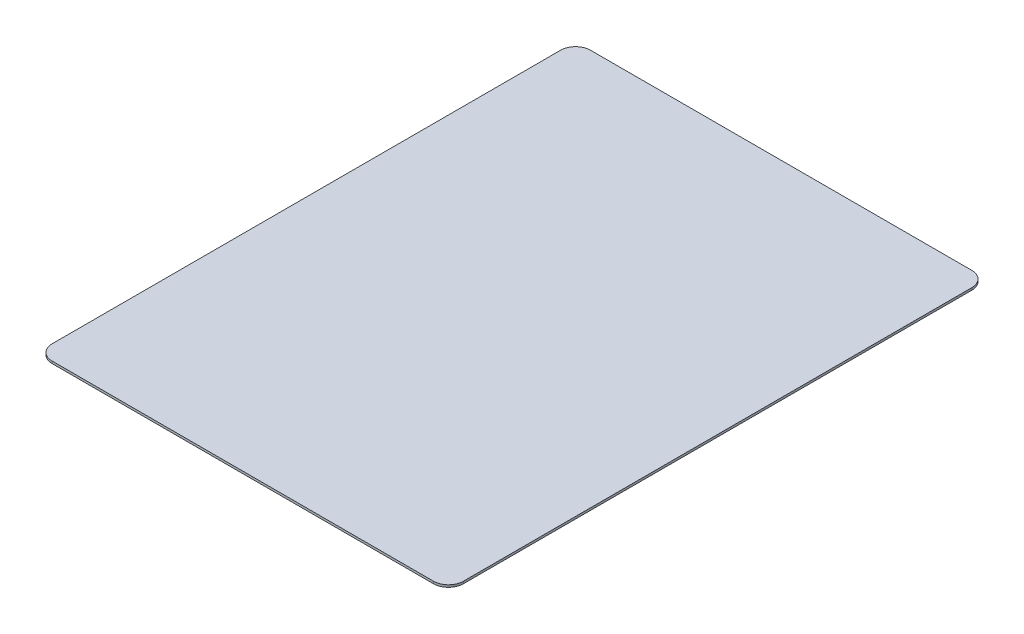
ISO-10303-21;
HEADER;
FILE_DESCRIPTION(('STEP AP214'),'2;1');
FILE_NAME('part.step','',(''),(''),'','','');
FILE_SCHEMA(('AUTOMOTIVE_DESIGN { 1 0 10303 214 1 1 1 1 }'));
ENDSEC;
DATA;
#1=APPLICATION_CONTEXT('core data for automotive mechanical design processes');
#2=APPLICATION_PROTOCOL_DEFINITION('international standard','automotive_design',2000,#1);
#3=PRODUCT_CONTEXT('',#1,'mechanical');
#4=PRODUCT('Part','Part','',(#3));
#5=PRODUCT_RELATED_PRODUCT_CATEGORY('part','',(#4));
#6=PRODUCT_DEFINITION_FORMATION('','',#4);
#7=PRODUCT_DEFINITION_CONTEXT('part definition',#1,'design');
#8=PRODUCT_DEFINITION('design','',#6,#7);
#9=PRODUCT_DEFINITION_SHAPE('','',#8);
#10=(LENGTH_UNIT() NAMED_UNIT(*) SI_UNIT(.MILLI.,.METRE.));
#11=(NAMED_UNIT(*) PLANE_ANGLE_UNIT() SI_UNIT($,.RADIAN.));
#12=(NAMED_UNIT(*) SI_UNIT($,.STERADIAN.) SOLID_ANGLE_UNIT());
#13=UNCERTAINTY_MEASURE_WITH_UNIT(LENGTH_MEASURE(1.E-05),#10,'distance_accuracy_value','');
#14=(GEOMETRIC_REPRESENTATION_CONTEXT(3) GLOBAL_UNCERTAINTY_ASSIGNED_CONTEXT((#13)) GLOBAL_UNIT_ASSIGNED_CONTEXT((#10,
#11,#12)) REPRESENTATION_CONTEXT('',''));
#15=CARTESIAN_POINT('',(0.,0.,0.));
#16=DIRECTION('',(0.,0.,1.));
#17=DIRECTION('',(1.,0.,0.));
#18=AXIS2_PLACEMENT_3D('',#15,#16,#17);
#19=CARTESIAN_POINT('',(-255.,3.,340.));
#20=DIRECTION('',(0.,-1.,0.));
#21=DIRECTION('',(0.,0.,-1.));
#22=AXIS2_PLACEMENT_3D('',#19,#20,#21);
#23=CYLINDRICAL_SURFACE('',#22,20.);
#24=CARTESIAN_POINT('',(-255.,0.,340.));
#25=DIRECTION('',(0.,1.,0.));
#26=DIRECTION('',(0.,0.,-1.));
#27=AXIS2_PLACEMENT_3D('',#24,#25,#26);
#28=CIRCLE('',#27,20.);
#29=CARTESIAN_POINT('',(-275.,0.,340.));
#30=VERTEX_POINT('',#29);
#31=CARTESIAN_POINT('',(-255.,0.,360.));
#32=VERTEX_POINT('',#31);
#33=EDGE_CURVE('E139',#30,#32,#28,.T.);
#34=ORIENTED_EDGE('',*,*,#33,.T.);
#35=DIRECTION('',(0.,-1.,0.));
#36=VECTOR('',#35,1.);
#37=CARTESIAN_POINT('',(-255.,3.,360.));
#38=LINE('',#37,#36);
#39=CARTESIAN_POINT('',(-255.,3.,360.));
#40=VERTEX_POINT('',#39);
#41=EDGE_CURVE('E11',#40,#32,#38,.T.);
#42=ORIENTED_EDGE('',*,*,#41,.F.);
#43=CARTESIAN_POINT('',(-255.,3.,340.));
#44=DIRECTION('',(0.,1.,0.));
#45=DIRECTION('',(0.,0.,-1.));
#46=AXIS2_PLACEMENT_3D('',#43,#44,#45);
#47=CIRCLE('',#46,20.);
#48=CARTESIAN_POINT('',(-275.,3.,340.));
#49=VERTEX_POINT('',#48);
#50=EDGE_CURVE('E153',#49,#40,#47,.T.);
#51=ORIENTED_EDGE('',*,*,#50,.F.);
#52=DIRECTION('',(0.,-1.,0.));
#53=VECTOR('',#52,1.);
#54=CARTESIAN_POINT('',(-275.,3.,340.));
#55=LINE('',#54,#53);
#56=EDGE_CURVE('E135',#49,#30,#55,.T.);
#57=ORIENTED_EDGE('',*,*,#56,.T.);
#58=EDGE_LOOP('',(#34,#42,#51,#57));
#59=FACE_BOUND('',#58,.T.);
#60=ADVANCED_FACE('F43',(#59),#23,.T.);
#61=CARTESIAN_POINT('',(-255.,3.,360.));
#62=DIRECTION('',(0.,0.,-1.));
#63=DIRECTION('',(-1.,0.,0.));
#64=AXIS2_PLACEMENT_3D('',#61,#62,#63);
#65=PLANE('',#64);
#66=DIRECTION('',(1.,0.,0.));
#67=VECTOR('',#66,1.);
#68=CARTESIAN_POINT('',(-255.,0.,360.));
#69=LINE('',#68,#67);
#70=CARTESIAN_POINT('',(255.,0.,360.));
#71=VERTEX_POINT('',#70);
#72=EDGE_CURVE('E142',#32,#71,#69,.T.);
#73=ORIENTED_EDGE('',*,*,#72,.T.);
#74=DIRECTION('',(0.,-1.,0.));
#75=VECTOR('',#74,1.);
#76=CARTESIAN_POINT('',(255.,3.,360.));
#77=LINE('',#76,#75);
#78=CARTESIAN_POINT('',(255.,3.,360.));
#79=VERTEX_POINT('',#78);
#80=EDGE_CURVE('E51',#79,#71,#77,.T.);
#81=ORIENTED_EDGE('',*,*,#80,.F.);
#82=DIRECTION('',(1.,0.,0.));
#83=VECTOR('',#82,1.);
#84=CARTESIAN_POINT('',(-255.,3.,360.));
#85=LINE('',#84,#83);
#86=EDGE_CURVE('E102',#40,#79,#85,.T.);
#87=ORIENTED_EDGE('',*,*,#86,.F.);
#88=ORIENTED_EDGE('',*,*,#41,.T.);
#89=EDGE_LOOP('',(#73,#81,#87,#88));
#90=FACE_BOUND('',#89,.T.);
#91=ADVANCED_FACE('F188',(#90),#65,.F.);
#92=CARTESIAN_POINT('',(255.,3.,340.));
#93=DIRECTION('',(0.,-1.,0.));
#94=DIRECTION('',(0.,0.,-1.));
#95=AXIS2_PLACEMENT_3D('',#92,#93,#94);
#96=CYLINDRICAL_SURFACE('',#95,20.);
#97=CARTESIAN_POINT('',(255.,0.,340.));
#98=DIRECTION('',(0.,1.,0.));
#99=DIRECTION('',(0.,0.,-1.));
#100=AXIS2_PLACEMENT_3D('',#97,#98,#99);
#101=CIRCLE('',#100,20.);
#102=CARTESIAN_POINT('',(275.,0.,340.));
#103=VERTEX_POINT('',#102);
#104=EDGE_CURVE('E144',#71,#103,#101,.T.);
#105=ORIENTED_EDGE('',*,*,#104,.T.);
#106=DIRECTION('',(0.,-1.,0.));
#107=VECTOR('',#106,1.);
#108=CARTESIAN_POINT('',(275.,3.,340.));
#109=LINE('',#108,#107);
#110=CARTESIAN_POINT('',(275.,3.,340.));
#111=VERTEX_POINT('',#110);
#112=EDGE_CURVE('E160',#111,#103,#109,.T.);
#113=ORIENTED_EDGE('',*,*,#112,.F.);
#114=CARTESIAN_POINT('',(255.,3.,340.));
#115=DIRECTION('',(0.,1.,0.));
#116=DIRECTION('',(0.,0.,-1.));
#117=AXIS2_PLACEMENT_3D('',#114,#115,#116);
#118=CIRCLE('',#117,20.);
#119=EDGE_CURVE('E168',#79,#111,#118,.T.);
#120=ORIENTED_EDGE('',*,*,#119,.F.);
#121=ORIENTED_EDGE('',*,*,#80,.T.);
#122=EDGE_LOOP('',(#105,#113,#120,#121));
#123=FACE_BOUND('',#122,.T.);
#124=ADVANCED_FACE('F166',(#123),#96,.T.);
#125=CARTESIAN_POINT('',(275.,3.,-340.));
#126=DIRECTION('',(-1.,0.,0.));
#127=DIRECTION('',(0.,0.,1.));
#128=AXIS2_PLACEMENT_3D('',#125,#126,#127);
#129=PLANE('',#128);
#130=DIRECTION('',(0.,0.,-1.));
#131=VECTOR('',#130,1.);
#132=CARTESIAN_POINT('',(275.,0.,-340.));
#133=LINE('',#132,#131);
#134=CARTESIAN_POINT('',(275.,0.,-340.));
#135=VERTEX_POINT('',#134);
#136=EDGE_CURVE('E146',#103,#135,#133,.T.);
#137=ORIENTED_EDGE('',*,*,#136,.T.);
#138=DIRECTION('',(0.,-1.,0.));
#139=VECTOR('',#138,1.);
#140=CARTESIAN_POINT('',(275.,3.,-340.));
#141=LINE('',#140,#139);
#142=CARTESIAN_POINT('',(275.,3.,-340.));
#143=VERTEX_POINT('',#142);
#144=EDGE_CURVE('E157',#143,#135,#141,.T.);
#145=ORIENTED_EDGE('',*,*,#144,.F.);
#146=DIRECTION('',(0.,0.,-1.));
#147=VECTOR('',#146,1.);
#148=CARTESIAN_POINT('',(275.,3.,-340.));
#149=LINE('',#148,#147);
#150=EDGE_CURVE('E180',#111,#143,#149,.T.);
#151=ORIENTED_EDGE('',*,*,#150,.F.);
#152=ORIENTED_EDGE('',*,*,#112,.T.);
#153=EDGE_LOOP('',(#137,#145,#151,#152));
#154=FACE_BOUND('',#153,.T.);
#155=ADVANCED_FACE('F176',(#154),#129,.F.);
#156=CARTESIAN_POINT('',(255.,3.,-340.));
#157=DIRECTION('',(0.,-1.,0.));
#158=DIRECTION('',(0.,0.,-1.));
#159=AXIS2_PLACEMENT_3D('',#156,#157,#158);
#160=CYLINDRICAL_SURFACE('',#159,20.);
#161=CARTESIAN_POINT('',(255.,0.,-340.));
#162=DIRECTION('',(0.,1.,0.));
#163=DIRECTION('',(0.,0.,1.));
#164=AXIS2_PLACEMENT_3D('',#161,#162,#163);
#165=CIRCLE('',#164,20.);
#166=CARTESIAN_POINT('',(255.,0.,-360.));
#167=VERTEX_POINT('',#166);
#168=EDGE_CURVE('E148',#135,#167,#165,.T.);
#169=ORIENTED_EDGE('',*,*,#168,.T.);
#170=DIRECTION('',(0.,-1.,0.));
#171=VECTOR('',#170,1.);
#172=CARTESIAN_POINT('',(255.,3.,-360.));
#173=LINE('',#172,#171);
#174=CARTESIAN_POINT('',(255.,3.,-360.));
#175=VERTEX_POINT('',#174);
#176=EDGE_CURVE('E130',#175,#167,#173,.T.);
#177=ORIENTED_EDGE('',*,*,#176,.F.);
#178=CARTESIAN_POINT('',(255.,3.,-340.));
#179=DIRECTION('',(0.,1.,0.));
#180=DIRECTION('',(0.,0.,1.));
#181=AXIS2_PLACEMENT_3D('',#178,#179,#180);
#182=CIRCLE('',#181,20.);
#183=EDGE_CURVE('E121',#143,#175,#182,.T.);
#184=ORIENTED_EDGE('',*,*,#183,.F.);
#185=ORIENTED_EDGE('',*,*,#144,.T.);
#186=EDGE_LOOP('',(#169,#177,#184,#185));
#187=FACE_BOUND('',#186,.T.);
#188=ADVANCED_FACE('F179',(#187),#160,.T.);
#189=CARTESIAN_POINT('',(-255.,3.,-360.));
#190=DIRECTION('',(0.,0.,1.));
#191=DIRECTION('',(1.,0.,0.));
#192=AXIS2_PLACEMENT_3D('',#189,#190,#191);
#193=PLANE('',#192);
#194=DIRECTION('',(-1.,0.,0.));
#195=VECTOR('',#194,1.);
#196=CARTESIAN_POINT('',(-255.,0.,-360.));
#197=LINE('',#196,#195);
#198=CARTESIAN_POINT('',(-255.,0.,-360.));
#199=VERTEX_POINT('',#198);
#200=EDGE_CURVE('E129',#167,#199,#197,.T.);
#201=ORIENTED_EDGE('',*,*,#200,.T.);
#202=DIRECTION('',(0.,-1.,0.));
#203=VECTOR('',#202,1.);
#204=CARTESIAN_POINT('',(-255.,3.,-360.));
#205=LINE('',#204,#203);
#206=CARTESIAN_POINT('',(-255.,3.,-360.));
#207=VERTEX_POINT('',#206);
#208=EDGE_CURVE('E126',#207,#199,#205,.T.);
#209=ORIENTED_EDGE('',*,*,#208,.F.);
#210=DIRECTION('',(-1.,0.,0.));
#211=VECTOR('',#210,1.);
#212=CARTESIAN_POINT('',(-255.,3.,-360.));
#213=LINE('',#212,#211);
#214=EDGE_CURVE('E115',#175,#207,#213,.T.);
#215=ORIENTED_EDGE('',*,*,#214,.F.);
#216=ORIENTED_EDGE('',*,*,#176,.T.);
#217=EDGE_LOOP('',(#201,#209,#215,#216));
#218=FACE_BOUND('',#217,.T.);
#219=ADVANCED_FACE('F127',(#218),#193,.F.);
#220=CARTESIAN_POINT('',(-255.,3.,-340.));
#221=DIRECTION('',(0.,-1.,0.));
#222=DIRECTION('',(0.,0.,-1.));
#223=AXIS2_PLACEMENT_3D('',#220,#221,#222);
#224=CYLINDRICAL_SURFACE('',#223,20.);
#225=CARTESIAN_POINT('',(-255.,0.,-340.));
#226=DIRECTION('',(0.,1.,0.));
#227=DIRECTION('',(0.,0.,1.));
#228=AXIS2_PLACEMENT_3D('',#225,#226,#227);
#229=CIRCLE('',#228,20.);
#230=CARTESIAN_POINT('',(-275.,0.,-340.));
#231=VERTEX_POINT('',#230);
#232=EDGE_CURVE('E88',#199,#231,#229,.T.);
#233=ORIENTED_EDGE('',*,*,#232,.T.);
#234=DIRECTION('',(0.,-1.,0.));
#235=VECTOR('',#234,1.);
#236=CARTESIAN_POINT('',(-275.,3.,-340.));
#237=LINE('',#236,#235);
#238=CARTESIAN_POINT('',(-275.,3.,-340.));
#239=VERTEX_POINT('',#238);
#240=EDGE_CURVE('E131',#239,#231,#237,.T.);
#241=ORIENTED_EDGE('',*,*,#240,.F.);
#242=CARTESIAN_POINT('',(-255.,3.,-340.));
#243=DIRECTION('',(0.,1.,0.));
#244=DIRECTION('',(0.,0.,1.));
#245=AXIS2_PLACEMENT_3D('',#242,#243,#244);
#246=CIRCLE('',#245,20.);
#247=EDGE_CURVE('E119',#207,#239,#246,.T.);
#248=ORIENTED_EDGE('',*,*,#247,.F.);
#249=ORIENTED_EDGE('',*,*,#208,.T.);
#250=EDGE_LOOP('',(#233,#241,#248,#249));
#251=FACE_BOUND('',#250,.T.);
#252=ADVANCED_FACE('F133',(#251),#224,.T.);
#253=CARTESIAN_POINT('',(-275.,3.,-340.));
#254=DIRECTION('',(1.,0.,0.));
#255=DIRECTION('',(0.,0.,-1.));
#256=AXIS2_PLACEMENT_3D('',#253,#254,#255);
#257=PLANE('',#256);
#258=DIRECTION('',(0.,0.,1.));
#259=VECTOR('',#258,1.);
#260=CARTESIAN_POINT('',(-275.,0.,-340.));
#261=LINE('',#260,#259);
#262=EDGE_CURVE('E94',#231,#30,#261,.T.);
#263=ORIENTED_EDGE('',*,*,#262,.T.);
#264=ORIENTED_EDGE('',*,*,#56,.F.);
#265=DIRECTION('',(0.,0.,1.));
#266=VECTOR('',#265,1.);
#267=CARTESIAN_POINT('',(-275.,3.,-340.));
#268=LINE('',#267,#266);
#269=EDGE_CURVE('E59',#239,#49,#268,.T.);
#270=ORIENTED_EDGE('',*,*,#269,.F.);
#271=ORIENTED_EDGE('',*,*,#240,.T.);
#272=EDGE_LOOP('',(#263,#264,#270,#271));
#273=FACE_BOUND('',#272,.T.);
#274=ADVANCED_FACE('F204',(#273),#257,.F.);
#275=CARTESIAN_POINT('',(-255.,3.,340.));
#276=DIRECTION('',(0.,-1.,0.));
#277=DIRECTION('',(0.,0.,-1.));
#278=AXIS2_PLACEMENT_3D('',#275,#276,#277);
#279=PLANE('',#278);
#280=ORIENTED_EDGE('',*,*,#50,.T.);
#281=ORIENTED_EDGE('',*,*,#86,.T.);
#282=ORIENTED_EDGE('',*,*,#119,.T.);
#283=ORIENTED_EDGE('',*,*,#150,.T.);
#284=ORIENTED_EDGE('',*,*,#183,.T.);
#285=ORIENTED_EDGE('',*,*,#214,.T.);
#286=ORIENTED_EDGE('',*,*,#247,.T.);
#287=ORIENTED_EDGE('',*,*,#269,.T.);
#288=EDGE_LOOP('',(#280,#281,#282,#283,#284,#285,#286,#287));
#289=FACE_BOUND('',#288,.T.);
#290=ADVANCED_FACE('F117',(#289),#279,.F.);
#291=CARTESIAN_POINT('',(-255.,0.,340.));
#292=DIRECTION('',(0.,-1.,0.));
#293=DIRECTION('',(0.,0.,-1.));
#294=AXIS2_PLACEMENT_3D('',#291,#292,#293);
#295=PLANE('',#294);
#296=ORIENTED_EDGE('',*,*,#33,.F.);
#297=ORIENTED_EDGE('',*,*,#262,.F.);
#298=ORIENTED_EDGE('',*,*,#232,.F.);
#299=ORIENTED_EDGE('',*,*,#200,.F.);
#300=ORIENTED_EDGE('',*,*,#168,.F.);
#301=ORIENTED_EDGE('',*,*,#136,.F.);
#302=ORIENTED_EDGE('',*,*,#104,.F.);
#303=ORIENTED_EDGE('',*,*,#72,.F.);
#304=EDGE_LOOP('',(#296,#297,#298,#299,#300,#301,#302,#303));
#305=FACE_BOUND('',#304,.T.);
#306=ADVANCED_FACE('F172',(#305),#295,.T.);
#307=CLOSED_SHELL('',(#60,#91,#124,#155,#188,#219,#252,#274,#290,#306));
#308=MANIFOLD_SOLID_BREP('B2',#307);
#309=ADVANCED_BREP_SHAPE_REPRESENTATION('',(#18,#308),#14);
#310=SHAPE_DEFINITION_REPRESENTATION(#9,#309);
ENDSEC;
END-ISO-10303-21;
